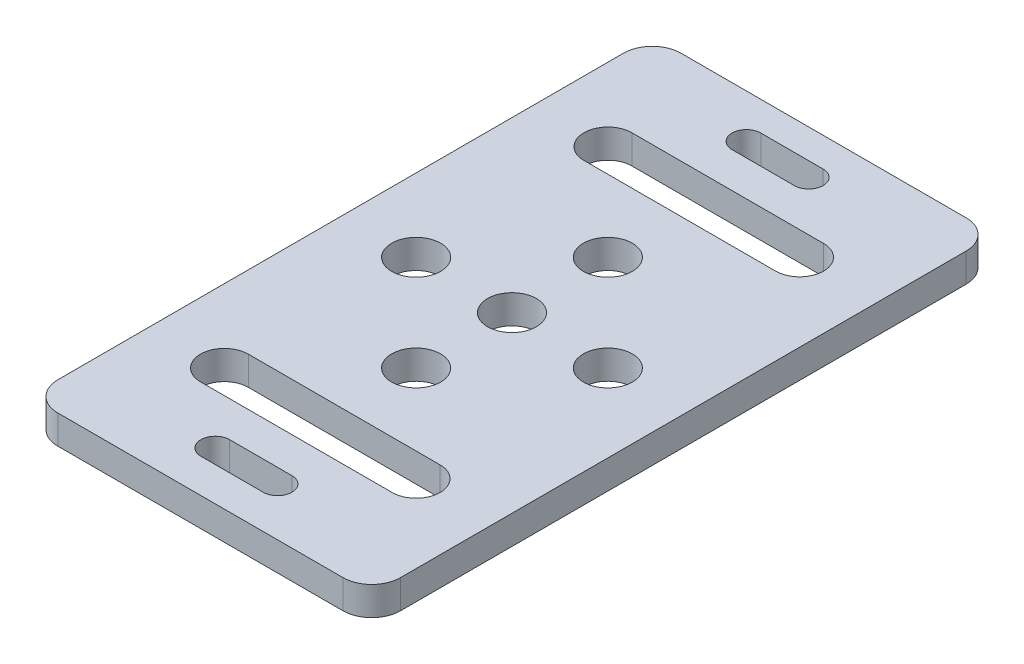
ISO-10303-21;
HEADER;
FILE_DESCRIPTION(('STEP AP214'),'2;1');
FILE_NAME('part.step','',(''),(''),'','','');
FILE_SCHEMA(('AUTOMOTIVE_DESIGN { 1 0 10303 214 1 1 1 1 }'));
ENDSEC;
DATA;
#1=APPLICATION_CONTEXT('core data for automotive mechanical design processes');
#2=APPLICATION_PROTOCOL_DEFINITION('international standard','automotive_design',2000,#1);
#3=PRODUCT_CONTEXT('',#1,'mechanical');
#4=PRODUCT('Part','Part','',(#3));
#5=PRODUCT_RELATED_PRODUCT_CATEGORY('part','',(#4));
#6=PRODUCT_DEFINITION_FORMATION('','',#4);
#7=PRODUCT_DEFINITION_CONTEXT('part definition',#1,'design');
#8=PRODUCT_DEFINITION('design','',#6,#7);
#9=PRODUCT_DEFINITION_SHAPE('','',#8);
#10=(LENGTH_UNIT() NAMED_UNIT(*) SI_UNIT(.MILLI.,.METRE.));
#11=(NAMED_UNIT(*) PLANE_ANGLE_UNIT() SI_UNIT($,.RADIAN.));
#12=(NAMED_UNIT(*) SI_UNIT($,.STERADIAN.) SOLID_ANGLE_UNIT());
#13=UNCERTAINTY_MEASURE_WITH_UNIT(LENGTH_MEASURE(1.E-05),#10,'distance_accuracy_value','');
#14=(GEOMETRIC_REPRESENTATION_CONTEXT(3) GLOBAL_UNCERTAINTY_ASSIGNED_CONTEXT((#13)) GLOBAL_UNIT_ASSIGNED_CONTEXT((#10,
#11,#12)) REPRESENTATION_CONTEXT('',''));
#15=CARTESIAN_POINT('',(0.,0.,0.));
#16=DIRECTION('',(0.,0.,1.));
#17=DIRECTION('',(1.,0.,0.));
#18=AXIS2_PLACEMENT_3D('',#15,#16,#17);
#19=CARTESIAN_POINT('',(-29.5,0.,32.5));
#20=DIRECTION('',(0.,0.,1.));
#21=DIRECTION('',(1.,0.,0.));
#22=AXIS2_PLACEMENT_3D('',#19,#20,#21);
#23=PLANE('',#22);
#24=DIRECTION('',(0.,1.,0.));
#25=VECTOR('',#24,1.);
#26=CARTESIAN_POINT('',(14.8721185989593,0.,32.5));
#27=LINE('',#26,#25);
#28=CARTESIAN_POINT('',(14.8721185989593,0.,32.5));
#29=VERTEX_POINT('',#28);
#30=CARTESIAN_POINT('',(14.8721185989593,3.,32.5));
#31=VERTEX_POINT('',#30);
#32=EDGE_CURVE('E232',#29,#31,#27,.T.);
#33=ORIENTED_EDGE('',*,*,#32,.T.);
#34=DIRECTION('',(1.,0.,0.));
#35=VECTOR('',#34,1.);
#36=CARTESIAN_POINT('',(0.,3.,32.5));
#37=LINE('',#36,#35);
#38=CARTESIAN_POINT('',(-14.8721185989593,3.,32.5));
#39=VERTEX_POINT('',#38);
#40=EDGE_CURVE('E262',#39,#31,#37,.T.);
#41=ORIENTED_EDGE('',*,*,#40,.F.);
#42=DIRECTION('',(0.,1.,0.));
#43=VECTOR('',#42,1.);
#44=CARTESIAN_POINT('',(-14.8721185989593,0.,32.5));
#45=LINE('',#44,#43);
#46=CARTESIAN_POINT('',(-14.8721185989593,0.,32.5));
#47=VERTEX_POINT('',#46);
#48=EDGE_CURVE('E257',#47,#39,#45,.T.);
#49=ORIENTED_EDGE('',*,*,#48,.F.);
#50=DIRECTION('',(1.,0.,0.));
#51=VECTOR('',#50,1.);
#52=CARTESIAN_POINT('',(0.,0.,32.5));
#53=LINE('',#52,#51);
#54=EDGE_CURVE('E261',#47,#29,#53,.T.);
#55=ORIENTED_EDGE('',*,*,#54,.T.);
#56=EDGE_LOOP('',(#33,#41,#49,#55));
#57=FACE_BOUND('',#56,.T.);
#58=ADVANCED_FACE('F38',(#57),#23,.T.);
#59=CARTESIAN_POINT('',(29.5,0.,-32.5));
#60=DIRECTION('',(0.,0.,-1.));
#61=DIRECTION('',(0.,-1.,0.));
#62=AXIS2_PLACEMENT_3D('',#59,#60,#61);
#63=PLANE('',#62);
#64=DIRECTION('',(-1.,0.,0.));
#65=VECTOR('',#64,1.);
#66=CARTESIAN_POINT('',(0.,3.,-32.5));
#67=LINE('',#66,#65);
#68=CARTESIAN_POINT('',(14.8721185989593,3.,-32.5));
#69=VERTEX_POINT('',#68);
#70=CARTESIAN_POINT('',(-14.8721185989593,3.,-32.5));
#71=VERTEX_POINT('',#70);
#72=EDGE_CURVE('E235',#69,#71,#67,.T.);
#73=ORIENTED_EDGE('',*,*,#72,.F.);
#74=DIRECTION('',(0.,1.,0.));
#75=VECTOR('',#74,1.);
#76=CARTESIAN_POINT('',(14.8721185989593,0.,-32.5));
#77=LINE('',#76,#75);
#78=CARTESIAN_POINT('',(14.8721185989593,0.,-32.5));
#79=VERTEX_POINT('',#78);
#80=EDGE_CURVE('E208',#79,#69,#77,.T.);
#81=ORIENTED_EDGE('',*,*,#80,.F.);
#82=DIRECTION('',(-1.,0.,0.));
#83=VECTOR('',#82,1.);
#84=CARTESIAN_POINT('',(0.,0.,-32.5));
#85=LINE('',#84,#83);
#86=CARTESIAN_POINT('',(-14.8721185989593,0.,-32.5));
#87=VERTEX_POINT('',#86);
#88=EDGE_CURVE('E222',#79,#87,#85,.T.);
#89=ORIENTED_EDGE('',*,*,#88,.T.);
#90=DIRECTION('',(0.,1.,0.));
#91=VECTOR('',#90,1.);
#92=CARTESIAN_POINT('',(-14.8721185989593,0.,-32.5));
#93=LINE('',#92,#91);
#94=EDGE_CURVE('E247',#87,#71,#93,.T.);
#95=ORIENTED_EDGE('',*,*,#94,.T.);
#96=EDGE_LOOP('',(#73,#81,#89,#95));
#97=FACE_BOUND('',#96,.T.);
#98=ADVANCED_FACE('F451',(#97),#63,.T.);
#99=CARTESIAN_POINT('',(0.,0.,0.));
#100=DIRECTION('',(0.,1.,0.));
#101=DIRECTION('',(1.,0.,0.));
#102=AXIS2_PLACEMENT_3D('',#99,#100,#101);
#103=PLANE('',#102);
#104=CARTESIAN_POINT('',(3.,0.,-27.95));
#105=DIRECTION('',(0.,-1.,0.));
#106=DIRECTION('',(0.,0.,1.));
#107=AXIS2_PLACEMENT_3D('',#104,#105,#106);
#108=CIRCLE('',#107,1.5);
#109=CARTESIAN_POINT('',(3.,0.,-29.45));
#110=VERTEX_POINT('',#109);
#111=CARTESIAN_POINT('',(3.,0.,-26.45));
#112=VERTEX_POINT('',#111);
#113=EDGE_CURVE('E325',#110,#112,#108,.T.);
#114=ORIENTED_EDGE('',*,*,#113,.F.);
#115=DIRECTION('',(1.,0.,0.));
#116=VECTOR('',#115,1.);
#117=CARTESIAN_POINT('',(-3.50000005215407,0.,-29.45));
#118=LINE('',#117,#116);
#119=CARTESIAN_POINT('',(-3.50000005215407,0.,-29.45));
#120=VERTEX_POINT('',#119);
#121=EDGE_CURVE('E352',#120,#110,#118,.T.);
#122=ORIENTED_EDGE('',*,*,#121,.F.);
#123=CARTESIAN_POINT('',(-3.50000005215407,0.,-27.95));
#124=DIRECTION('',(0.,-1.,0.));
#125=DIRECTION('',(0.,0.,-1.));
#126=AXIS2_PLACEMENT_3D('',#123,#124,#125);
#127=CIRCLE('',#126,1.5);
#128=CARTESIAN_POINT('',(-3.50000005215407,0.,-26.45));
#129=VERTEX_POINT('',#128);
#130=EDGE_CURVE('E284',#129,#120,#127,.T.);
#131=ORIENTED_EDGE('',*,*,#130,.F.);
#132=DIRECTION('',(-1.,0.,0.));
#133=VECTOR('',#132,1.);
#134=CARTESIAN_POINT('',(3.,0.,-26.45));
#135=LINE('',#134,#133);
#136=EDGE_CURVE('E338',#112,#129,#135,.T.);
#137=ORIENTED_EDGE('',*,*,#136,.F.);
#138=EDGE_LOOP('',(#114,#122,#131,#137));
#139=FACE_BOUND('',#138,.T.);
#140=CARTESIAN_POINT('',(3.,0.,27.45));
#141=DIRECTION('',(0.,-1.,0.));
#142=DIRECTION('',(0.,0.,1.));
#143=AXIS2_PLACEMENT_3D('',#140,#141,#142);
#144=CIRCLE('',#143,1.5);
#145=CARTESIAN_POINT('',(3.,0.,25.95));
#146=VERTEX_POINT('',#145);
#147=CARTESIAN_POINT('',(3.,0.,28.95));
#148=VERTEX_POINT('',#147);
#149=EDGE_CURVE('E326',#146,#148,#144,.T.);
#150=ORIENTED_EDGE('',*,*,#149,.F.);
#151=DIRECTION('',(1.,0.,0.));
#152=VECTOR('',#151,1.);
#153=CARTESIAN_POINT('',(3.,0.,25.95));
#154=LINE('',#153,#152);
#155=CARTESIAN_POINT('',(-3.50000005215406,0.,25.95));
#156=VERTEX_POINT('',#155);
#157=EDGE_CURVE('E312',#156,#146,#154,.T.);
#158=ORIENTED_EDGE('',*,*,#157,.F.);
#159=CARTESIAN_POINT('',(-3.50000005215406,0.,27.45));
#160=DIRECTION('',(0.,-1.,0.));
#161=DIRECTION('',(0.,0.,-1.));
#162=AXIS2_PLACEMENT_3D('',#159,#160,#161);
#163=CIRCLE('',#162,1.5);
#164=CARTESIAN_POINT('',(-3.50000005215406,0.,28.95));
#165=VERTEX_POINT('',#164);
#166=EDGE_CURVE('E333',#165,#156,#163,.T.);
#167=ORIENTED_EDGE('',*,*,#166,.F.);
#168=DIRECTION('',(-1.,0.,0.));
#169=VECTOR('',#168,1.);
#170=CARTESIAN_POINT('',(-3.50000005215406,0.,28.95));
#171=LINE('',#170,#169);
#172=EDGE_CURVE('E280',#148,#165,#171,.T.);
#173=ORIENTED_EDGE('',*,*,#172,.F.);
#174=EDGE_LOOP('',(#150,#158,#167,#173));
#175=FACE_BOUND('',#174,.T.);
#176=CARTESIAN_POINT('',(-0.250000000000004,0.,-10.25));
#177=DIRECTION('',(0.,-1.,0.));
#178=DIRECTION('',(1.,0.,0.));
#179=AXIS2_PLACEMENT_3D('',#176,#177,#178);
#180=CIRCLE('',#179,2.55);
#181=CARTESIAN_POINT('',(2.3,0.,-10.25));
#182=VERTEX_POINT('',#181);
#183=EDGE_CURVE('E343',#182,#182,#180,.T.);
#184=ORIENTED_EDGE('',*,*,#183,.F.);
#185=EDGE_LOOP('',(#184));
#186=FACE_BOUND('',#185,.T.);
#187=CARTESIAN_POINT('',(-10.25,0.,-0.249999999999997));
#188=DIRECTION('',(0.,-1.,0.));
#189=DIRECTION('',(1.,0.,0.));
#190=AXIS2_PLACEMENT_3D('',#187,#188,#189);
#191=CIRCLE('',#190,2.55);
#192=CARTESIAN_POINT('',(-7.7,0.,-0.249999999999997));
#193=VERTEX_POINT('',#192);
#194=EDGE_CURVE('E346',#193,#193,#191,.T.);
#195=ORIENTED_EDGE('',*,*,#194,.F.);
#196=EDGE_LOOP('',(#195));
#197=FACE_BOUND('',#196,.T.);
#198=CARTESIAN_POINT('',(-0.250000000000004,0.,-0.25));
#199=DIRECTION('',(0.,-1.,0.));
#200=DIRECTION('',(1.,0.,0.));
#201=AXIS2_PLACEMENT_3D('',#198,#199,#200);
#202=CIRCLE('',#201,2.55);
#203=CARTESIAN_POINT('',(2.3,0.,-0.25));
#204=VERTEX_POINT('',#203);
#205=EDGE_CURVE('E363',#204,#204,#202,.T.);
#206=ORIENTED_EDGE('',*,*,#205,.F.);
#207=EDGE_LOOP('',(#206));
#208=FACE_BOUND('',#207,.T.);
#209=CARTESIAN_POINT('',(-0.250000000000004,0.,9.75));
#210=DIRECTION('',(0.,-1.,0.));
#211=DIRECTION('',(1.,0.,0.));
#212=AXIS2_PLACEMENT_3D('',#209,#210,#211);
#213=CIRCLE('',#212,2.55);
#214=CARTESIAN_POINT('',(2.3,0.,9.75));
#215=VERTEX_POINT('',#214);
#216=EDGE_CURVE('E366',#215,#215,#213,.T.);
#217=ORIENTED_EDGE('',*,*,#216,.F.);
#218=EDGE_LOOP('',(#217));
#219=FACE_BOUND('',#218,.T.);
#220=CARTESIAN_POINT('',(9.75,0.,-20.25));
#221=DIRECTION('',(0.,-1.,0.));
#222=DIRECTION('',(0.,0.,1.));
#223=AXIS2_PLACEMENT_3D('',#220,#221,#222);
#224=CIRCLE('',#223,2.5);
#225=CARTESIAN_POINT('',(9.75,0.,-22.75));
#226=VERTEX_POINT('',#225);
#227=CARTESIAN_POINT('',(9.75,0.,-17.75));
#228=VERTEX_POINT('',#227);
#229=EDGE_CURVE('E370',#226,#228,#224,.T.);
#230=ORIENTED_EDGE('',*,*,#229,.F.);
#231=DIRECTION('',(1.,0.,0.));
#232=VECTOR('',#231,1.);
#233=CARTESIAN_POINT('',(9.75,0.,-22.75));
#234=LINE('',#233,#232);
#235=CARTESIAN_POINT('',(-10.25,0.,-22.75));
#236=VERTEX_POINT('',#235);
#237=EDGE_CURVE('E391',#236,#226,#234,.T.);
#238=ORIENTED_EDGE('',*,*,#237,.F.);
#239=CARTESIAN_POINT('',(-10.25,0.,-20.25));
#240=DIRECTION('',(0.,-1.,0.));
#241=DIRECTION('',(0.,0.,-1.));
#242=AXIS2_PLACEMENT_3D('',#239,#240,#241);
#243=CIRCLE('',#242,2.5);
#244=CARTESIAN_POINT('',(-10.25,0.,-17.75));
#245=VERTEX_POINT('',#244);
#246=EDGE_CURVE('E305',#245,#236,#243,.T.);
#247=ORIENTED_EDGE('',*,*,#246,.F.);
#248=DIRECTION('',(-1.,0.,0.));
#249=VECTOR('',#248,1.);
#250=CARTESIAN_POINT('',(-10.25,0.,-17.75));
#251=LINE('',#250,#249);
#252=EDGE_CURVE('E306',#228,#245,#251,.T.);
#253=ORIENTED_EDGE('',*,*,#252,.F.);
#254=EDGE_LOOP('',(#230,#238,#247,#253));
#255=FACE_BOUND('',#254,.T.);
#256=CARTESIAN_POINT('',(9.75,0.,-0.25));
#257=DIRECTION('',(0.,-1.,0.));
#258=DIRECTION('',(1.,0.,0.));
#259=AXIS2_PLACEMENT_3D('',#256,#257,#258);
#260=CIRCLE('',#259,2.55);
#261=CARTESIAN_POINT('',(12.3,0.,-0.25));
#262=VERTEX_POINT('',#261);
#263=EDGE_CURVE('E275',#262,#262,#260,.T.);
#264=ORIENTED_EDGE('',*,*,#263,.F.);
#265=EDGE_LOOP('',(#264));
#266=FACE_BOUND('',#265,.T.);
#267=CARTESIAN_POINT('',(9.75,0.,19.75));
#268=DIRECTION('',(0.,-1.,0.));
#269=DIRECTION('',(0.,0.,1.));
#270=AXIS2_PLACEMENT_3D('',#267,#268,#269);
#271=CIRCLE('',#270,2.5);
#272=CARTESIAN_POINT('',(9.75,0.,17.25));
#273=VERTEX_POINT('',#272);
#274=CARTESIAN_POINT('',(9.75,0.,22.25));
#275=VERTEX_POINT('',#274);
#276=EDGE_CURVE('E309',#273,#275,#271,.T.);
#277=ORIENTED_EDGE('',*,*,#276,.F.);
#278=DIRECTION('',(1.,0.,0.));
#279=VECTOR('',#278,1.);
#280=CARTESIAN_POINT('',(9.75,0.,17.25));
#281=LINE('',#280,#279);
#282=CARTESIAN_POINT('',(-10.25,0.,17.25));
#283=VERTEX_POINT('',#282);
#284=EDGE_CURVE('E279',#283,#273,#281,.T.);
#285=ORIENTED_EDGE('',*,*,#284,.F.);
#286=CARTESIAN_POINT('',(-10.25,0.,19.75));
#287=DIRECTION('',(0.,-1.,0.));
#288=DIRECTION('',(0.,0.,-1.));
#289=AXIS2_PLACEMENT_3D('',#286,#287,#288);
#290=CIRCLE('',#289,2.5);
#291=CARTESIAN_POINT('',(-10.25,0.,22.25));
#292=VERTEX_POINT('',#291);
#293=EDGE_CURVE('E361',#292,#283,#290,.T.);
#294=ORIENTED_EDGE('',*,*,#293,.F.);
#295=DIRECTION('',(-1.,0.,0.));
#296=VECTOR('',#295,1.);
#297=CARTESIAN_POINT('',(-10.25,0.,22.25));
#298=LINE('',#297,#296);
#299=EDGE_CURVE('E362',#275,#292,#298,.T.);
#300=ORIENTED_EDGE('',*,*,#299,.F.);
#301=EDGE_LOOP('',(#277,#285,#294,#300));
#302=FACE_BOUND('',#301,.T.);
#303=DIRECTION('',(0.,0.,1.));
#304=VECTOR('',#303,1.);
#305=CARTESIAN_POINT('',(17.8721185989593,0.,-29.5));
#306=LINE('',#305,#304);
#307=CARTESIAN_POINT('',(17.8721185989593,0.,-29.5));
#308=VERTEX_POINT('',#307);
#309=CARTESIAN_POINT('',(17.8721185989593,0.,29.5));
#310=VERTEX_POINT('',#309);
#311=EDGE_CURVE('E211',#308,#310,#306,.T.);
#312=ORIENTED_EDGE('',*,*,#311,.T.);
#313=CARTESIAN_POINT('',(14.8721185989593,0.,29.5));
#314=DIRECTION('',(0.,-1.,0.));
#315=DIRECTION('',(0.,0.,1.));
#316=AXIS2_PLACEMENT_3D('',#313,#314,#315);
#317=CIRCLE('',#316,3.);
#318=EDGE_CURVE('E216',#310,#29,#317,.T.);
#319=ORIENTED_EDGE('',*,*,#318,.T.);
#320=ORIENTED_EDGE('',*,*,#54,.F.);
#321=CARTESIAN_POINT('',(-14.8721185989593,0.,29.5));
#322=DIRECTION('',(0.,-1.,0.));
#323=DIRECTION('',(0.,0.,-1.));
#324=AXIS2_PLACEMENT_3D('',#321,#322,#323);
#325=CIRCLE('',#324,3.);
#326=CARTESIAN_POINT('',(-17.8721185989593,0.,29.5));
#327=VERTEX_POINT('',#326);
#328=EDGE_CURVE('E240',#47,#327,#325,.T.);
#329=ORIENTED_EDGE('',*,*,#328,.T.);
#330=DIRECTION('',(0.,0.,-1.));
#331=VECTOR('',#330,1.);
#332=CARTESIAN_POINT('',(-17.8721185989593,0.,-29.5));
#333=LINE('',#332,#331);
#334=CARTESIAN_POINT('',(-17.8721185989593,0.,-29.5));
#335=VERTEX_POINT('',#334);
#336=EDGE_CURVE('E244',#327,#335,#333,.T.);
#337=ORIENTED_EDGE('',*,*,#336,.T.);
#338=CARTESIAN_POINT('',(-14.8721185989593,0.,-29.5));
#339=DIRECTION('',(0.,-1.,0.));
#340=DIRECTION('',(0.,0.,-1.));
#341=AXIS2_PLACEMENT_3D('',#338,#339,#340);
#342=CIRCLE('',#341,3.);
#343=EDGE_CURVE('E238',#335,#87,#342,.T.);
#344=ORIENTED_EDGE('',*,*,#343,.T.);
#345=ORIENTED_EDGE('',*,*,#88,.F.);
#346=CARTESIAN_POINT('',(14.8721185989593,0.,-29.5));
#347=DIRECTION('',(0.,-1.,0.));
#348=DIRECTION('',(0.,0.,1.));
#349=AXIS2_PLACEMENT_3D('',#346,#347,#348);
#350=CIRCLE('',#349,3.);
#351=EDGE_CURVE('E63',#79,#308,#350,.T.);
#352=ORIENTED_EDGE('',*,*,#351,.T.);
#353=EDGE_LOOP('',(#312,#319,#320,#329,#337,#344,#345,#352));
#354=FACE_BOUND('',#353,.T.);
#355=ADVANCED_FACE('F219',(#139,#175,#186,#197,#208,#219,#255,#266,#302,#354),#103,.F.);
#356=CARTESIAN_POINT('',(0.,3.,0.));
#357=DIRECTION('',(0.,1.,0.));
#358=DIRECTION('',(1.,0.,0.));
#359=AXIS2_PLACEMENT_3D('',#356,#357,#358);
#360=PLANE('',#359);
#361=CARTESIAN_POINT('',(14.8721185989593,3.,29.5));
#362=DIRECTION('',(0.,-1.,0.));
#363=DIRECTION('',(0.,0.,1.));
#364=AXIS2_PLACEMENT_3D('',#361,#362,#363);
#365=CIRCLE('',#364,3.);
#366=CARTESIAN_POINT('',(17.8721185989593,3.,29.5));
#367=VERTEX_POINT('',#366);
#368=EDGE_CURVE('E223',#367,#31,#365,.T.);
#369=ORIENTED_EDGE('',*,*,#368,.F.);
#370=DIRECTION('',(0.,0.,1.));
#371=VECTOR('',#370,1.);
#372=CARTESIAN_POINT('',(17.8721185989593,3.,-29.5));
#373=LINE('',#372,#371);
#374=CARTESIAN_POINT('',(17.8721185989593,3.,-29.5));
#375=VERTEX_POINT('',#374);
#376=EDGE_CURVE('E225',#375,#367,#373,.T.);
#377=ORIENTED_EDGE('',*,*,#376,.F.);
#378=CARTESIAN_POINT('',(14.8721185989593,3.,-29.5));
#379=DIRECTION('',(0.,-1.,0.));
#380=DIRECTION('',(0.,0.,1.));
#381=AXIS2_PLACEMENT_3D('',#378,#379,#380);
#382=CIRCLE('',#381,3.);
#383=EDGE_CURVE('E203',#69,#375,#382,.T.);
#384=ORIENTED_EDGE('',*,*,#383,.F.);
#385=ORIENTED_EDGE('',*,*,#72,.T.);
#386=CARTESIAN_POINT('',(-14.8721185989593,3.,-29.5));
#387=DIRECTION('',(0.,-1.,0.));
#388=DIRECTION('',(0.,0.,-1.));
#389=AXIS2_PLACEMENT_3D('',#386,#387,#388);
#390=CIRCLE('',#389,3.);
#391=CARTESIAN_POINT('',(-17.8721185989593,3.,-29.5));
#392=VERTEX_POINT('',#391);
#393=EDGE_CURVE('E55',#392,#71,#390,.T.);
#394=ORIENTED_EDGE('',*,*,#393,.F.);
#395=DIRECTION('',(0.,0.,-1.));
#396=VECTOR('',#395,1.);
#397=CARTESIAN_POINT('',(-17.8721185989593,3.,-29.5));
#398=LINE('',#397,#396);
#399=CARTESIAN_POINT('',(-17.8721185989593,3.,29.5));
#400=VERTEX_POINT('',#399);
#401=EDGE_CURVE('E241',#400,#392,#398,.T.);
#402=ORIENTED_EDGE('',*,*,#401,.F.);
#403=CARTESIAN_POINT('',(-14.8721185989593,3.,29.5));
#404=DIRECTION('',(0.,-1.,0.));
#405=DIRECTION('',(0.,0.,-1.));
#406=AXIS2_PLACEMENT_3D('',#403,#404,#405);
#407=CIRCLE('',#406,3.);
#408=EDGE_CURVE('E249',#39,#400,#407,.T.);
#409=ORIENTED_EDGE('',*,*,#408,.F.);
#410=ORIENTED_EDGE('',*,*,#40,.T.);
#411=EDGE_LOOP('',(#369,#377,#384,#385,#394,#402,#409,#410));
#412=FACE_BOUND('',#411,.T.);
#413=CARTESIAN_POINT('',(3.,3.,-27.95));
#414=DIRECTION('',(0.,-1.,0.));
#415=DIRECTION('',(0.,0.,1.));
#416=AXIS2_PLACEMENT_3D('',#413,#414,#415);
#417=CIRCLE('',#416,1.5);
#418=CARTESIAN_POINT('',(3.,3.,-29.45));
#419=VERTEX_POINT('',#418);
#420=CARTESIAN_POINT('',(3.,3.,-26.45));
#421=VERTEX_POINT('',#420);
#422=EDGE_CURVE('E11',#419,#421,#417,.T.);
#423=ORIENTED_EDGE('',*,*,#422,.T.);
#424=DIRECTION('',(-1.,0.,0.));
#425=VECTOR('',#424,1.);
#426=CARTESIAN_POINT('',(3.,3.,-26.45));
#427=LINE('',#426,#425);
#428=CARTESIAN_POINT('',(-3.50000005215407,3.,-26.45));
#429=VERTEX_POINT('',#428);
#430=EDGE_CURVE('E47',#421,#429,#427,.T.);
#431=ORIENTED_EDGE('',*,*,#430,.T.);
#432=CARTESIAN_POINT('',(-3.50000005215407,3.,-27.95));
#433=DIRECTION('',(0.,-1.,0.));
#434=DIRECTION('',(0.,0.,-1.));
#435=AXIS2_PLACEMENT_3D('',#432,#433,#434);
#436=CIRCLE('',#435,1.5);
#437=CARTESIAN_POINT('',(-3.50000005215407,3.,-29.45));
#438=VERTEX_POINT('',#437);
#439=EDGE_CURVE('E288',#429,#438,#436,.T.);
#440=ORIENTED_EDGE('',*,*,#439,.T.);
#441=DIRECTION('',(1.,0.,0.));
#442=VECTOR('',#441,1.);
#443=CARTESIAN_POINT('',(-3.50000005215407,3.,-29.45));
#444=LINE('',#443,#442);
#445=EDGE_CURVE('E291',#438,#419,#444,.T.);
#446=ORIENTED_EDGE('',*,*,#445,.T.);
#447=EDGE_LOOP('',(#423,#431,#440,#446));
#448=FACE_BOUND('',#447,.T.);
#449=CARTESIAN_POINT('',(3.,3.,27.45));
#450=DIRECTION('',(0.,-1.,0.));
#451=DIRECTION('',(0.,0.,1.));
#452=AXIS2_PLACEMENT_3D('',#449,#450,#451);
#453=CIRCLE('',#452,1.5);
#454=CARTESIAN_POINT('',(3.,3.,25.95));
#455=VERTEX_POINT('',#454);
#456=CARTESIAN_POINT('',(3.,3.,28.95));
#457=VERTEX_POINT('',#456);
#458=EDGE_CURVE('E350',#455,#457,#453,.T.);
#459=ORIENTED_EDGE('',*,*,#458,.T.);
#460=DIRECTION('',(-1.,0.,0.));
#461=VECTOR('',#460,1.);
#462=CARTESIAN_POINT('',(-3.50000005215406,3.,28.95));
#463=LINE('',#462,#461);
#464=CARTESIAN_POINT('',(-3.50000005215406,3.,28.95));
#465=VERTEX_POINT('',#464);
#466=EDGE_CURVE('E347',#457,#465,#463,.T.);
#467=ORIENTED_EDGE('',*,*,#466,.T.);
#468=CARTESIAN_POINT('',(-3.50000005215406,3.,27.45));
#469=DIRECTION('',(0.,-1.,0.));
#470=DIRECTION('',(0.,0.,-1.));
#471=AXIS2_PLACEMENT_3D('',#468,#469,#470);
#472=CIRCLE('',#471,1.5);
#473=CARTESIAN_POINT('',(-3.50000005215406,3.,25.95));
#474=VERTEX_POINT('',#473);
#475=EDGE_CURVE('E351',#465,#474,#472,.T.);
#476=ORIENTED_EDGE('',*,*,#475,.T.);
#477=DIRECTION('',(1.,0.,0.));
#478=VECTOR('',#477,1.);
#479=CARTESIAN_POINT('',(3.,3.,25.95));
#480=LINE('',#479,#478);
#481=EDGE_CURVE('E273',#474,#455,#480,.T.);
#482=ORIENTED_EDGE('',*,*,#481,.T.);
#483=EDGE_LOOP('',(#459,#467,#476,#482));
#484=FACE_BOUND('',#483,.T.);
#485=CARTESIAN_POINT('',(-0.250000000000004,3.,-10.25));
#486=DIRECTION('',(0.,-1.,0.));
#487=DIRECTION('',(1.,0.,0.));
#488=AXIS2_PLACEMENT_3D('',#485,#486,#487);
#489=CIRCLE('',#488,2.55);
#490=CARTESIAN_POINT('',(2.3,3.,-10.25));
#491=VERTEX_POINT('',#490);
#492=EDGE_CURVE('E270',#491,#491,#489,.T.);
#493=ORIENTED_EDGE('',*,*,#492,.T.);
#494=EDGE_LOOP('',(#493));
#495=FACE_BOUND('',#494,.T.);
#496=CARTESIAN_POINT('',(-10.25,3.,-0.249999999999997));
#497=DIRECTION('',(0.,-1.,0.));
#498=DIRECTION('',(1.,0.,0.));
#499=AXIS2_PLACEMENT_3D('',#496,#497,#498);
#500=CIRCLE('',#499,2.55);
#501=CARTESIAN_POINT('',(-7.7,3.,-0.249999999999997));
#502=VERTEX_POINT('',#501);
#503=EDGE_CURVE('E274',#502,#502,#500,.T.);
#504=ORIENTED_EDGE('',*,*,#503,.T.);
#505=EDGE_LOOP('',(#504));
#506=FACE_BOUND('',#505,.T.);
#507=CARTESIAN_POINT('',(-0.250000000000004,3.,-0.25));
#508=DIRECTION('',(0.,-1.,0.));
#509=DIRECTION('',(1.,0.,0.));
#510=AXIS2_PLACEMENT_3D('',#507,#508,#509);
#511=CIRCLE('',#510,2.55);
#512=CARTESIAN_POINT('',(2.3,3.,-0.25));
#513=VERTEX_POINT('',#512);
#514=EDGE_CURVE('E317',#513,#513,#511,.T.);
#515=ORIENTED_EDGE('',*,*,#514,.T.);
#516=EDGE_LOOP('',(#515));
#517=FACE_BOUND('',#516,.T.);
#518=CARTESIAN_POINT('',(-0.250000000000004,3.,9.75));
#519=DIRECTION('',(0.,-1.,0.));
#520=DIRECTION('',(1.,0.,0.));
#521=AXIS2_PLACEMENT_3D('',#518,#519,#520);
#522=CIRCLE('',#521,2.55);
#523=CARTESIAN_POINT('',(2.3,3.,9.75));
#524=VERTEX_POINT('',#523);
#525=EDGE_CURVE('E295',#524,#524,#522,.T.);
#526=ORIENTED_EDGE('',*,*,#525,.T.);
#527=EDGE_LOOP('',(#526));
#528=FACE_BOUND('',#527,.T.);
#529=CARTESIAN_POINT('',(9.75,3.,-20.25));
#530=DIRECTION('',(0.,-1.,0.));
#531=DIRECTION('',(0.,0.,1.));
#532=AXIS2_PLACEMENT_3D('',#529,#530,#531);
#533=CIRCLE('',#532,2.5);
#534=CARTESIAN_POINT('',(9.75,3.,-22.75));
#535=VERTEX_POINT('',#534);
#536=CARTESIAN_POINT('',(9.75,3.,-17.75));
#537=VERTEX_POINT('',#536);
#538=EDGE_CURVE('E292',#535,#537,#533,.T.);
#539=ORIENTED_EDGE('',*,*,#538,.T.);
#540=DIRECTION('',(-1.,0.,0.));
#541=VECTOR('',#540,1.);
#542=CARTESIAN_POINT('',(-10.25,3.,-17.75));
#543=LINE('',#542,#541);
#544=CARTESIAN_POINT('',(-10.25,3.,-17.75));
#545=VERTEX_POINT('',#544);
#546=EDGE_CURVE('E296',#537,#545,#543,.T.);
#547=ORIENTED_EDGE('',*,*,#546,.T.);
#548=CARTESIAN_POINT('',(-10.25,3.,-20.25));
#549=DIRECTION('',(0.,-1.,0.));
#550=DIRECTION('',(0.,0.,-1.));
#551=AXIS2_PLACEMENT_3D('',#548,#549,#550);
#552=CIRCLE('',#551,2.5);
#553=CARTESIAN_POINT('',(-10.25,3.,-22.75));
#554=VERTEX_POINT('',#553);
#555=EDGE_CURVE('E329',#545,#554,#552,.T.);
#556=ORIENTED_EDGE('',*,*,#555,.T.);
#557=DIRECTION('',(1.,0.,0.));
#558=VECTOR('',#557,1.);
#559=CARTESIAN_POINT('',(9.75,3.,-22.75));
#560=LINE('',#559,#558);
#561=EDGE_CURVE('E332',#554,#535,#560,.T.);
#562=ORIENTED_EDGE('',*,*,#561,.T.);
#563=EDGE_LOOP('',(#539,#547,#556,#562));
#564=FACE_BOUND('',#563,.T.);
#565=CARTESIAN_POINT('',(9.75,3.,-0.25));
#566=DIRECTION('',(0.,-1.,0.));
#567=DIRECTION('',(1.,0.,0.));
#568=AXIS2_PLACEMENT_3D('',#565,#566,#567);
#569=CIRCLE('',#568,2.55);
#570=CARTESIAN_POINT('',(12.3,3.,-0.25));
#571=VERTEX_POINT('',#570);
#572=EDGE_CURVE('E322',#571,#571,#569,.T.);
#573=ORIENTED_EDGE('',*,*,#572,.T.);
#574=EDGE_LOOP('',(#573));
#575=FACE_BOUND('',#574,.T.);
#576=CARTESIAN_POINT('',(9.75,3.,19.75));
#577=DIRECTION('',(0.,-1.,0.));
#578=DIRECTION('',(0.,0.,1.));
#579=AXIS2_PLACEMENT_3D('',#576,#577,#578);
#580=CIRCLE('',#579,2.5);
#581=CARTESIAN_POINT('',(9.75,3.,17.25));
#582=VERTEX_POINT('',#581);
#583=CARTESIAN_POINT('',(9.75,3.,22.25));
#584=VERTEX_POINT('',#583);
#585=EDGE_CURVE('E300',#582,#584,#580,.T.);
#586=ORIENTED_EDGE('',*,*,#585,.T.);
#587=DIRECTION('',(-1.,0.,0.));
#588=VECTOR('',#587,1.);
#589=CARTESIAN_POINT('',(-10.25,3.,22.25));
#590=LINE('',#589,#588);
#591=CARTESIAN_POINT('',(-10.25,3.,22.25));
#592=VERTEX_POINT('',#591);
#593=EDGE_CURVE('E297',#584,#592,#590,.T.);
#594=ORIENTED_EDGE('',*,*,#593,.T.);
#595=CARTESIAN_POINT('',(-10.25,3.,19.75));
#596=DIRECTION('',(0.,-1.,0.));
#597=DIRECTION('',(0.,0.,-1.));
#598=AXIS2_PLACEMENT_3D('',#595,#596,#597);
#599=CIRCLE('',#598,2.5);
#600=CARTESIAN_POINT('',(-10.25,3.,17.25));
#601=VERTEX_POINT('',#600);
#602=EDGE_CURVE('E301',#592,#601,#599,.T.);
#603=ORIENTED_EDGE('',*,*,#602,.T.);
#604=DIRECTION('',(1.,0.,0.));
#605=VECTOR('',#604,1.);
#606=CARTESIAN_POINT('',(9.75,3.,17.25));
#607=LINE('',#606,#605);
#608=EDGE_CURVE('E355',#601,#582,#607,.T.);
#609=ORIENTED_EDGE('',*,*,#608,.T.);
#610=EDGE_LOOP('',(#586,#594,#603,#609));
#611=FACE_BOUND('',#610,.T.);
#612=ADVANCED_FACE('F431',(#412,#448,#484,#495,#506,#517,#528,#564,#575,#611),#360,.T.);
#613=CARTESIAN_POINT('',(-3.50000005215407,0.,-29.45));
#614=DIRECTION('',(0.,0.,1.));
#615=DIRECTION('',(1.,0.,0.));
#616=AXIS2_PLACEMENT_3D('',#613,#614,#615);
#617=PLANE('',#616);
#618=ORIENTED_EDGE('',*,*,#121,.T.);
#619=DIRECTION('',(0.,1.,0.));
#620=VECTOR('',#619,1.);
#621=CARTESIAN_POINT('',(3.,0.,-29.45));
#622=LINE('',#621,#620);
#623=EDGE_CURVE('E285',#110,#419,#622,.T.);
#624=ORIENTED_EDGE('',*,*,#623,.T.);
#625=ORIENTED_EDGE('',*,*,#445,.F.);
#626=DIRECTION('',(0.,1.,0.));
#627=VECTOR('',#626,1.);
#628=CARTESIAN_POINT('',(-3.50000005215407,0.,-29.45));
#629=LINE('',#628,#627);
#630=EDGE_CURVE('E286',#120,#438,#629,.T.);
#631=ORIENTED_EDGE('',*,*,#630,.F.);
#632=EDGE_LOOP('',(#618,#624,#625,#631));
#633=FACE_BOUND('',#632,.T.);
#634=ADVANCED_FACE('F476',(#633),#617,.T.);
#635=CARTESIAN_POINT('',(-3.50000005215407,0.,-27.95));
#636=DIRECTION('',(0.,1.,0.));
#637=DIRECTION('',(0.,0.,-1.));
#638=AXIS2_PLACEMENT_3D('',#635,#636,#637);
#639=CYLINDRICAL_SURFACE('',#638,1.5);
#640=ORIENTED_EDGE('',*,*,#130,.T.);
#641=ORIENTED_EDGE('',*,*,#630,.T.);
#642=ORIENTED_EDGE('',*,*,#439,.F.);
#643=DIRECTION('',(0.,1.,0.));
#644=VECTOR('',#643,1.);
#645=CARTESIAN_POINT('',(-3.50000005215407,0.,-26.45));
#646=LINE('',#645,#644);
#647=EDGE_CURVE('E382',#129,#429,#646,.T.);
#648=ORIENTED_EDGE('',*,*,#647,.F.);
#649=EDGE_LOOP('',(#640,#641,#642,#648));
#650=FACE_BOUND('',#649,.T.);
#651=ADVANCED_FACE('F472',(#650),#639,.F.);
#652=CARTESIAN_POINT('',(3.,0.,-26.45));
#653=DIRECTION('',(0.,0.,-1.));
#654=DIRECTION('',(0.,-1.,0.));
#655=AXIS2_PLACEMENT_3D('',#652,#653,#654);
#656=PLANE('',#655);
#657=ORIENTED_EDGE('',*,*,#136,.T.);
#658=ORIENTED_EDGE('',*,*,#647,.T.);
#659=ORIENTED_EDGE('',*,*,#430,.F.);
#660=DIRECTION('',(0.,1.,0.));
#661=VECTOR('',#660,1.);
#662=CARTESIAN_POINT('',(3.,0.,-26.45));
#663=LINE('',#662,#661);
#664=EDGE_CURVE('E315',#112,#421,#663,.T.);
#665=ORIENTED_EDGE('',*,*,#664,.F.);
#666=EDGE_LOOP('',(#657,#658,#659,#665));
#667=FACE_BOUND('',#666,.T.);
#668=ADVANCED_FACE('F475',(#667),#656,.T.);
#669=CARTESIAN_POINT('',(3.,0.,-27.95));
#670=DIRECTION('',(0.,1.,0.));
#671=DIRECTION('',(0.,0.,1.));
#672=AXIS2_PLACEMENT_3D('',#669,#670,#671);
#673=CYLINDRICAL_SURFACE('',#672,1.5);
#674=ORIENTED_EDGE('',*,*,#113,.T.);
#675=ORIENTED_EDGE('',*,*,#664,.T.);
#676=ORIENTED_EDGE('',*,*,#422,.F.);
#677=ORIENTED_EDGE('',*,*,#623,.F.);
#678=EDGE_LOOP('',(#674,#675,#676,#677));
#679=FACE_BOUND('',#678,.T.);
#680=ADVANCED_FACE('F530',(#679),#673,.F.);
#681=CARTESIAN_POINT('',(-3.50000005215406,0.,25.95));
#682=DIRECTION('',(0.,0.,1.));
#683=DIRECTION('',(1.,0.,0.));
#684=AXIS2_PLACEMENT_3D('',#681,#682,#683);
#685=PLANE('',#684);
#686=ORIENTED_EDGE('',*,*,#157,.T.);
#687=DIRECTION('',(0.,1.,0.));
#688=VECTOR('',#687,1.);
#689=CARTESIAN_POINT('',(3.,0.,25.95));
#690=LINE('',#689,#688);
#691=EDGE_CURVE('E316',#146,#455,#690,.T.);
#692=ORIENTED_EDGE('',*,*,#691,.T.);
#693=ORIENTED_EDGE('',*,*,#481,.F.);
#694=DIRECTION('',(0.,1.,0.));
#695=VECTOR('',#694,1.);
#696=CARTESIAN_POINT('',(-3.50000005215406,0.,25.95));
#697=LINE('',#696,#695);
#698=EDGE_CURVE('E282',#156,#474,#697,.T.);
#699=ORIENTED_EDGE('',*,*,#698,.F.);
#700=EDGE_LOOP('',(#686,#692,#693,#699));
#701=FACE_BOUND('',#700,.T.);
#702=ADVANCED_FACE('F40',(#701),#685,.T.);
#703=CARTESIAN_POINT('',(-3.50000005215406,0.,27.45));
#704=DIRECTION('',(0.,1.,0.));
#705=DIRECTION('',(0.,0.,-1.));
#706=AXIS2_PLACEMENT_3D('',#703,#704,#705);
#707=CYLINDRICAL_SURFACE('',#706,1.5);
#708=ORIENTED_EDGE('',*,*,#166,.T.);
#709=ORIENTED_EDGE('',*,*,#698,.T.);
#710=ORIENTED_EDGE('',*,*,#475,.F.);
#711=DIRECTION('',(0.,1.,0.));
#712=VECTOR('',#711,1.);
#713=CARTESIAN_POINT('',(-3.50000005215406,0.,28.95));
#714=LINE('',#713,#712);
#715=EDGE_CURVE('E283',#165,#465,#714,.T.);
#716=ORIENTED_EDGE('',*,*,#715,.F.);
#717=EDGE_LOOP('',(#708,#709,#710,#716));
#718=FACE_BOUND('',#717,.T.);
#719=ADVANCED_FACE('F470',(#718),#707,.F.);
#720=CARTESIAN_POINT('',(3.,0.,28.95));
#721=DIRECTION('',(0.,0.,-1.));
#722=DIRECTION('',(0.,-1.,0.));
#723=AXIS2_PLACEMENT_3D('',#720,#721,#722);
#724=PLANE('',#723);
#725=ORIENTED_EDGE('',*,*,#172,.T.);
#726=ORIENTED_EDGE('',*,*,#715,.T.);
#727=ORIENTED_EDGE('',*,*,#466,.F.);
#728=DIRECTION('',(0.,1.,0.));
#729=VECTOR('',#728,1.);
#730=CARTESIAN_POINT('',(3.,0.,28.95));
#731=LINE('',#730,#729);
#732=EDGE_CURVE('E328',#148,#457,#731,.T.);
#733=ORIENTED_EDGE('',*,*,#732,.F.);
#734=EDGE_LOOP('',(#725,#726,#727,#733));
#735=FACE_BOUND('',#734,.T.);
#736=ADVANCED_FACE('F466',(#735),#724,.T.);
#737=CARTESIAN_POINT('',(3.,0.,27.45));
#738=DIRECTION('',(0.,1.,0.));
#739=DIRECTION('',(0.,0.,1.));
#740=AXIS2_PLACEMENT_3D('',#737,#738,#739);
#741=CYLINDRICAL_SURFACE('',#740,1.5);
#742=ORIENTED_EDGE('',*,*,#149,.T.);
#743=ORIENTED_EDGE('',*,*,#732,.T.);
#744=ORIENTED_EDGE('',*,*,#458,.F.);
#745=ORIENTED_EDGE('',*,*,#691,.F.);
#746=EDGE_LOOP('',(#742,#743,#744,#745));
#747=FACE_BOUND('',#746,.T.);
#748=ADVANCED_FACE('F469',(#747),#741,.F.);
#749=CARTESIAN_POINT('',(-0.250000000000004,0.,-10.25));
#750=DIRECTION('',(0.,1.,0.));
#751=DIRECTION('',(1.,0.,0.));
#752=AXIS2_PLACEMENT_3D('',#749,#750,#751);
#753=CYLINDRICAL_SURFACE('',#752,2.55);
#754=ORIENTED_EDGE('',*,*,#183,.T.);
#755=EDGE_LOOP('',(#754));
#756=FACE_BOUND('',#755,.T.);
#757=ORIENTED_EDGE('',*,*,#492,.F.);
#758=EDGE_LOOP('',(#757));
#759=FACE_BOUND('',#758,.T.);
#760=ADVANCED_FACE('F478',(#756,#759),#753,.F.);
#761=CARTESIAN_POINT('',(-10.25,0.,-0.249999999999997));
#762=DIRECTION('',(0.,1.,0.));
#763=DIRECTION('',(1.,0.,0.));
#764=AXIS2_PLACEMENT_3D('',#761,#762,#763);
#765=CYLINDRICAL_SURFACE('',#764,2.55);
#766=ORIENTED_EDGE('',*,*,#194,.T.);
#767=EDGE_LOOP('',(#766));
#768=FACE_BOUND('',#767,.T.);
#769=ORIENTED_EDGE('',*,*,#503,.F.);
#770=EDGE_LOOP('',(#769));
#771=FACE_BOUND('',#770,.T.);
#772=ADVANCED_FACE('F480',(#768,#771),#765,.F.);
#773=CARTESIAN_POINT('',(-0.250000000000004,0.,-0.25));
#774=DIRECTION('',(0.,1.,0.));
#775=DIRECTION('',(1.,0.,0.));
#776=AXIS2_PLACEMENT_3D('',#773,#774,#775);
#777=CYLINDRICAL_SURFACE('',#776,2.55);
#778=ORIENTED_EDGE('',*,*,#205,.T.);
#779=EDGE_LOOP('',(#778));
#780=FACE_BOUND('',#779,.T.);
#781=ORIENTED_EDGE('',*,*,#514,.F.);
#782=EDGE_LOOP('',(#781));
#783=FACE_BOUND('',#782,.T.);
#784=ADVANCED_FACE('F484',(#780,#783),#777,.F.);
#785=CARTESIAN_POINT('',(-0.250000000000004,0.,9.75));
#786=DIRECTION('',(0.,1.,0.));
#787=DIRECTION('',(1.,0.,0.));
#788=AXIS2_PLACEMENT_3D('',#785,#786,#787);
#789=CYLINDRICAL_SURFACE('',#788,2.55);
#790=ORIENTED_EDGE('',*,*,#216,.T.);
#791=EDGE_LOOP('',(#790));
#792=FACE_BOUND('',#791,.T.);
#793=ORIENTED_EDGE('',*,*,#525,.F.);
#794=EDGE_LOOP('',(#793));
#795=FACE_BOUND('',#794,.T.);
#796=ADVANCED_FACE('F482',(#792,#795),#789,.F.);
#797=CARTESIAN_POINT('',(-10.25,0.,-22.75));
#798=DIRECTION('',(0.,0.,1.));
#799=DIRECTION('',(1.,0.,0.));
#800=AXIS2_PLACEMENT_3D('',#797,#798,#799);
#801=PLANE('',#800);
#802=ORIENTED_EDGE('',*,*,#237,.T.);
#803=DIRECTION('',(0.,1.,0.));
#804=VECTOR('',#803,1.);
#805=CARTESIAN_POINT('',(9.75,0.,-22.75));
#806=LINE('',#805,#804);
#807=EDGE_CURVE('E311',#226,#535,#806,.T.);
#808=ORIENTED_EDGE('',*,*,#807,.T.);
#809=ORIENTED_EDGE('',*,*,#561,.F.);
#810=DIRECTION('',(0.,1.,0.));
#811=VECTOR('',#810,1.);
#812=CARTESIAN_POINT('',(-10.25,0.,-22.75));
#813=LINE('',#812,#811);
#814=EDGE_CURVE('E302',#236,#554,#813,.T.);
#815=ORIENTED_EDGE('',*,*,#814,.F.);
#816=EDGE_LOOP('',(#802,#808,#809,#815));
#817=FACE_BOUND('',#816,.T.);
#818=ADVANCED_FACE('F422',(#817),#801,.T.);
#819=CARTESIAN_POINT('',(-10.25,0.,-20.25));
#820=DIRECTION('',(0.,1.,0.));
#821=DIRECTION('',(0.,0.,-1.));
#822=AXIS2_PLACEMENT_3D('',#819,#820,#821);
#823=CYLINDRICAL_SURFACE('',#822,2.5);
#824=ORIENTED_EDGE('',*,*,#246,.T.);
#825=ORIENTED_EDGE('',*,*,#814,.T.);
#826=ORIENTED_EDGE('',*,*,#555,.F.);
#827=DIRECTION('',(0.,1.,0.));
#828=VECTOR('',#827,1.);
#829=CARTESIAN_POINT('',(-10.25,0.,-17.75));
#830=LINE('',#829,#828);
#831=EDGE_CURVE('E367',#245,#545,#830,.T.);
#832=ORIENTED_EDGE('',*,*,#831,.F.);
#833=EDGE_LOOP('',(#824,#825,#826,#832));
#834=FACE_BOUND('',#833,.T.);
#835=ADVANCED_FACE('F435',(#834),#823,.F.);
#836=CARTESIAN_POINT('',(9.75,0.,-17.75));
#837=DIRECTION('',(0.,0.,-1.));
#838=DIRECTION('',(-1.,0.,0.));
#839=AXIS2_PLACEMENT_3D('',#836,#837,#838);
#840=PLANE('',#839);
#841=ORIENTED_EDGE('',*,*,#252,.T.);
#842=ORIENTED_EDGE('',*,*,#831,.T.);
#843=ORIENTED_EDGE('',*,*,#546,.F.);
#844=DIRECTION('',(0.,1.,0.));
#845=VECTOR('',#844,1.);
#846=CARTESIAN_POINT('',(9.75,0.,-17.75));
#847=LINE('',#846,#845);
#848=EDGE_CURVE('E278',#228,#537,#847,.T.);
#849=ORIENTED_EDGE('',*,*,#848,.F.);
#850=EDGE_LOOP('',(#841,#842,#843,#849));
#851=FACE_BOUND('',#850,.T.);
#852=ADVANCED_FACE('F438',(#851),#840,.T.);
#853=CARTESIAN_POINT('',(9.75,0.,-20.25));
#854=DIRECTION('',(0.,1.,0.));
#855=DIRECTION('',(0.,0.,1.));
#856=AXIS2_PLACEMENT_3D('',#853,#854,#855);
#857=CYLINDRICAL_SURFACE('',#856,2.5);
#858=ORIENTED_EDGE('',*,*,#229,.T.);
#859=ORIENTED_EDGE('',*,*,#848,.T.);
#860=ORIENTED_EDGE('',*,*,#538,.F.);
#861=ORIENTED_EDGE('',*,*,#807,.F.);
#862=EDGE_LOOP('',(#858,#859,#860,#861));
#863=FACE_BOUND('',#862,.T.);
#864=ADVANCED_FACE('F427',(#863),#857,.F.);
#865=CARTESIAN_POINT('',(9.75,0.,-0.25));
#866=DIRECTION('',(0.,1.,0.));
#867=DIRECTION('',(1.,0.,0.));
#868=AXIS2_PLACEMENT_3D('',#865,#866,#867);
#869=CYLINDRICAL_SURFACE('',#868,2.55);
#870=ORIENTED_EDGE('',*,*,#263,.T.);
#871=EDGE_LOOP('',(#870));
#872=FACE_BOUND('',#871,.T.);
#873=ORIENTED_EDGE('',*,*,#572,.F.);
#874=EDGE_LOOP('',(#873));
#875=FACE_BOUND('',#874,.T.);
#876=ADVANCED_FACE('F445',(#872,#875),#869,.F.);
#877=CARTESIAN_POINT('',(-10.25,0.,17.25));
#878=DIRECTION('',(0.,0.,1.));
#879=DIRECTION('',(1.,0.,0.));
#880=AXIS2_PLACEMENT_3D('',#877,#878,#879);
#881=PLANE('',#880);
#882=ORIENTED_EDGE('',*,*,#284,.T.);
#883=DIRECTION('',(0.,1.,0.));
#884=VECTOR('',#883,1.);
#885=CARTESIAN_POINT('',(9.75,0.,17.25));
#886=LINE('',#885,#884);
#887=EDGE_CURVE('E403',#273,#582,#886,.T.);
#888=ORIENTED_EDGE('',*,*,#887,.T.);
#889=ORIENTED_EDGE('',*,*,#608,.F.);
#890=DIRECTION('',(0.,1.,0.));
#891=VECTOR('',#890,1.);
#892=CARTESIAN_POINT('',(-10.25,0.,17.25));
#893=LINE('',#892,#891);
#894=EDGE_CURVE('E358',#283,#601,#893,.T.);
#895=ORIENTED_EDGE('',*,*,#894,.F.);
#896=EDGE_LOOP('',(#882,#888,#889,#895));
#897=FACE_BOUND('',#896,.T.);
#898=ADVANCED_FACE('F464',(#897),#881,.T.);
#899=CARTESIAN_POINT('',(-10.25,0.,19.75));
#900=DIRECTION('',(0.,1.,0.));
#901=DIRECTION('',(0.,0.,-1.));
#902=AXIS2_PLACEMENT_3D('',#899,#900,#901);
#903=CYLINDRICAL_SURFACE('',#902,2.5);
#904=ORIENTED_EDGE('',*,*,#293,.T.);
#905=ORIENTED_EDGE('',*,*,#894,.T.);
#906=ORIENTED_EDGE('',*,*,#602,.F.);
#907=DIRECTION('',(0.,1.,0.));
#908=VECTOR('',#907,1.);
#909=CARTESIAN_POINT('',(-10.25,0.,22.25));
#910=LINE('',#909,#908);
#911=EDGE_CURVE('E42',#292,#592,#910,.T.);
#912=ORIENTED_EDGE('',*,*,#911,.F.);
#913=EDGE_LOOP('',(#904,#905,#906,#912));
#914=FACE_BOUND('',#913,.T.);
#915=ADVANCED_FACE('F508',(#914),#903,.F.);
#916=CARTESIAN_POINT('',(9.75,0.,22.25));
#917=DIRECTION('',(0.,0.,-1.));
#918=DIRECTION('',(-1.,0.,0.));
#919=AXIS2_PLACEMENT_3D('',#916,#917,#918);
#920=PLANE('',#919);
#921=ORIENTED_EDGE('',*,*,#299,.T.);
#922=ORIENTED_EDGE('',*,*,#911,.T.);
#923=ORIENTED_EDGE('',*,*,#593,.F.);
#924=DIRECTION('',(0.,1.,0.));
#925=VECTOR('',#924,1.);
#926=CARTESIAN_POINT('',(9.75,0.,22.25));
#927=LINE('',#926,#925);
#928=EDGE_CURVE('E265',#275,#584,#927,.T.);
#929=ORIENTED_EDGE('',*,*,#928,.F.);
#930=EDGE_LOOP('',(#921,#922,#923,#929));
#931=FACE_BOUND('',#930,.T.);
#932=ADVANCED_FACE('F510',(#931),#920,.T.);
#933=CARTESIAN_POINT('',(9.75,0.,19.75));
#934=DIRECTION('',(0.,1.,0.));
#935=DIRECTION('',(0.,0.,1.));
#936=AXIS2_PLACEMENT_3D('',#933,#934,#935);
#937=CYLINDRICAL_SURFACE('',#936,2.5);
#938=ORIENTED_EDGE('',*,*,#276,.T.);
#939=ORIENTED_EDGE('',*,*,#928,.T.);
#940=ORIENTED_EDGE('',*,*,#585,.F.);
#941=ORIENTED_EDGE('',*,*,#887,.F.);
#942=EDGE_LOOP('',(#938,#939,#940,#941));
#943=FACE_BOUND('',#942,.T.);
#944=ADVANCED_FACE('F513',(#943),#937,.F.);
#945=CARTESIAN_POINT('',(-14.8721185989593,0.,-29.5));
#946=DIRECTION('',(0.,1.,0.));
#947=DIRECTION('',(0.,0.,1.));
#948=AXIS2_PLACEMENT_3D('',#945,#946,#947);
#949=CYLINDRICAL_SURFACE('',#948,3.);
#950=ORIENTED_EDGE('',*,*,#393,.T.);
#951=ORIENTED_EDGE('',*,*,#94,.F.);
#952=ORIENTED_EDGE('',*,*,#343,.F.);
#953=DIRECTION('',(0.,1.,0.));
#954=VECTOR('',#953,1.);
#955=CARTESIAN_POINT('',(-17.8721185989593,0.,-29.5));
#956=LINE('',#955,#954);
#957=EDGE_CURVE('E230',#335,#392,#956,.T.);
#958=ORIENTED_EDGE('',*,*,#957,.T.);
#959=EDGE_LOOP('',(#950,#951,#952,#958));
#960=FACE_BOUND('',#959,.T.);
#961=ADVANCED_FACE('F528',(#960),#949,.T.);
#962=CARTESIAN_POINT('',(-17.8721185989593,0.,-29.5));
#963=DIRECTION('',(1.,0.,0.));
#964=DIRECTION('',(0.,0.,-1.));
#965=AXIS2_PLACEMENT_3D('',#962,#963,#964);
#966=PLANE('',#965);
#967=ORIENTED_EDGE('',*,*,#401,.T.);
#968=ORIENTED_EDGE('',*,*,#957,.F.);
#969=ORIENTED_EDGE('',*,*,#336,.F.);
#970=DIRECTION('',(0.,1.,0.));
#971=VECTOR('',#970,1.);
#972=CARTESIAN_POINT('',(-17.8721185989593,0.,29.5));
#973=LINE('',#972,#971);
#974=EDGE_CURVE('E255',#327,#400,#973,.T.);
#975=ORIENTED_EDGE('',*,*,#974,.T.);
#976=EDGE_LOOP('',(#967,#968,#969,#975));
#977=FACE_BOUND('',#976,.T.);
#978=ADVANCED_FACE('F579',(#977),#966,.F.);
#979=CARTESIAN_POINT('',(-14.8721185989593,0.,29.5));
#980=DIRECTION('',(0.,1.,0.));
#981=DIRECTION('',(0.,0.,1.));
#982=AXIS2_PLACEMENT_3D('',#979,#980,#981);
#983=CYLINDRICAL_SURFACE('',#982,3.);
#984=ORIENTED_EDGE('',*,*,#408,.T.);
#985=ORIENTED_EDGE('',*,*,#974,.F.);
#986=ORIENTED_EDGE('',*,*,#328,.F.);
#987=ORIENTED_EDGE('',*,*,#48,.T.);
#988=EDGE_LOOP('',(#984,#985,#986,#987));
#989=FACE_BOUND('',#988,.T.);
#990=ADVANCED_FACE('F580',(#989),#983,.T.);
#991=CARTESIAN_POINT('',(14.8721185989593,0.,29.5));
#992=DIRECTION('',(0.,1.,0.));
#993=DIRECTION('',(0.,0.,1.));
#994=AXIS2_PLACEMENT_3D('',#991,#992,#993);
#995=CYLINDRICAL_SURFACE('',#994,3.);
#996=ORIENTED_EDGE('',*,*,#368,.T.);
#997=ORIENTED_EDGE('',*,*,#32,.F.);
#998=ORIENTED_EDGE('',*,*,#318,.F.);
#999=DIRECTION('',(0.,1.,0.));
#1000=VECTOR('',#999,1.);
#1001=CARTESIAN_POINT('',(17.8721185989593,0.,29.5));
#1002=LINE('',#1001,#1000);
#1003=EDGE_CURVE('E207',#310,#367,#1002,.T.);
#1004=ORIENTED_EDGE('',*,*,#1003,.T.);
#1005=EDGE_LOOP('',(#996,#997,#998,#1004));
#1006=FACE_BOUND('',#1005,.T.);
#1007=ADVANCED_FACE('F583',(#1006),#995,.T.);
#1008=CARTESIAN_POINT('',(17.8721185989593,0.,-29.5));
#1009=DIRECTION('',(-1.,0.,0.));
#1010=DIRECTION('',(0.,0.,1.));
#1011=AXIS2_PLACEMENT_3D('',#1008,#1009,#1010);
#1012=PLANE('',#1011);
#1013=ORIENTED_EDGE('',*,*,#376,.T.);
#1014=ORIENTED_EDGE('',*,*,#1003,.F.);
#1015=ORIENTED_EDGE('',*,*,#311,.F.);
#1016=DIRECTION('',(0.,1.,0.));
#1017=VECTOR('',#1016,1.);
#1018=CARTESIAN_POINT('',(17.8721185989593,0.,-29.5));
#1019=LINE('',#1018,#1017);
#1020=EDGE_CURVE('E199',#308,#375,#1019,.T.);
#1021=ORIENTED_EDGE('',*,*,#1020,.T.);
#1022=EDGE_LOOP('',(#1013,#1014,#1015,#1021));
#1023=FACE_BOUND('',#1022,.T.);
#1024=ADVANCED_FACE('F212',(#1023),#1012,.F.);
#1025=CARTESIAN_POINT('',(14.8721185989593,0.,-29.5));
#1026=DIRECTION('',(0.,1.,0.));
#1027=DIRECTION('',(0.,0.,1.));
#1028=AXIS2_PLACEMENT_3D('',#1025,#1026,#1027);
#1029=CYLINDRICAL_SURFACE('',#1028,3.);
#1030=ORIENTED_EDGE('',*,*,#383,.T.);
#1031=ORIENTED_EDGE('',*,*,#1020,.F.);
#1032=ORIENTED_EDGE('',*,*,#351,.F.);
#1033=ORIENTED_EDGE('',*,*,#80,.T.);
#1034=EDGE_LOOP('',(#1030,#1031,#1032,#1033));
#1035=FACE_BOUND('',#1034,.T.);
#1036=ADVANCED_FACE('F201',(#1035),#1029,.T.);
#1037=CLOSED_SHELL('',(#58,#98,#355,#612,#634,#651,#668,#680,#702,#719,#736,#748,#760,#772,#784,
#796,#818,#835,#852,#864,#876,#898,#915,#932,#944,#961,#978,#990,#1007,#1024,#1036));
#1038=MANIFOLD_SOLID_BREP('B2',#1037);
#1039=ADVANCED_BREP_SHAPE_REPRESENTATION('',(#18,#1038),#14);
#1040=SHAPE_DEFINITION_REPRESENTATION(#9,#1039);
ENDSEC;
END-ISO-10303-21;
